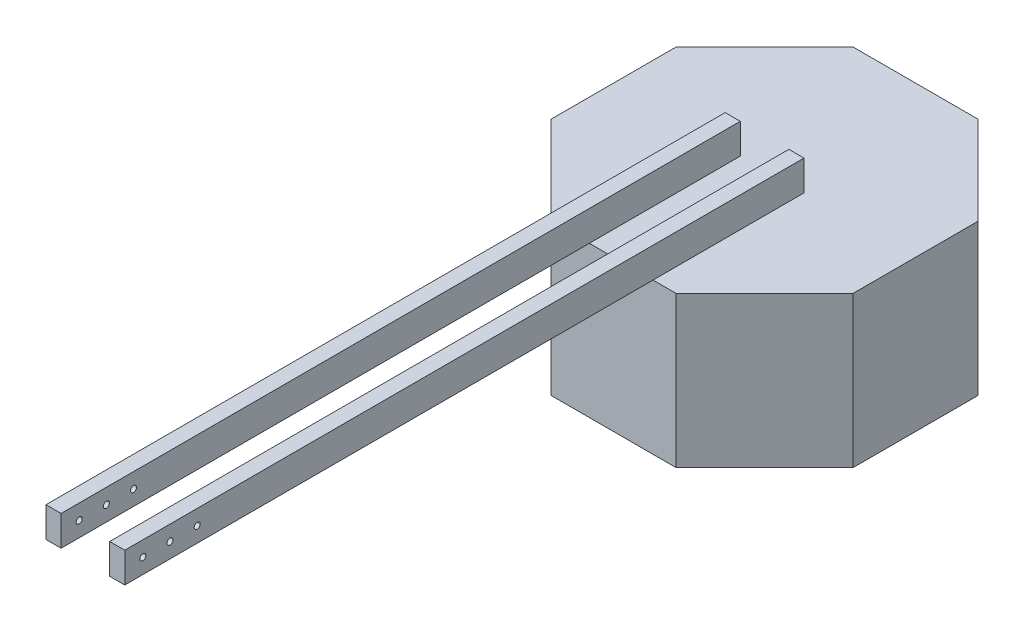
ISO-10303-21;
HEADER;
FILE_DESCRIPTION(('STEP AP214'),'2;1');
FILE_NAME('part.step','',(''),(''),'','','');
FILE_SCHEMA(('AUTOMOTIVE_DESIGN { 1 0 10303 214 1 1 1 1 }'));
ENDSEC;
DATA;
#1=APPLICATION_CONTEXT('core data for automotive mechanical design processes');
#2=APPLICATION_PROTOCOL_DEFINITION('international standard','automotive_design',2000,#1);
#3=PRODUCT_CONTEXT('',#1,'mechanical');
#4=PRODUCT('Part','Part','',(#3));
#5=PRODUCT_RELATED_PRODUCT_CATEGORY('part','',(#4));
#6=PRODUCT_DEFINITION_FORMATION('','',#4);
#7=PRODUCT_DEFINITION_CONTEXT('part definition',#1,'design');
#8=PRODUCT_DEFINITION('design','',#6,#7);
#9=PRODUCT_DEFINITION_SHAPE('','',#8);
#10=(LENGTH_UNIT() NAMED_UNIT(*) SI_UNIT(.MILLI.,.METRE.));
#11=(NAMED_UNIT(*) PLANE_ANGLE_UNIT() SI_UNIT($,.RADIAN.));
#12=(NAMED_UNIT(*) SI_UNIT($,.STERADIAN.) SOLID_ANGLE_UNIT());
#13=UNCERTAINTY_MEASURE_WITH_UNIT(LENGTH_MEASURE(1.E-05),#10,'distance_accuracy_value','');
#14=(GEOMETRIC_REPRESENTATION_CONTEXT(3) GLOBAL_UNCERTAINTY_ASSIGNED_CONTEXT((#13)) GLOBAL_UNIT_ASSIGNED_CONTEXT((#10,
#11,#12)) REPRESENTATION_CONTEXT('',''));
#15=CARTESIAN_POINT('',(0.,0.,0.));
#16=DIRECTION('',(0.,0.,1.));
#17=DIRECTION('',(1.,0.,0.));
#18=AXIS2_PLACEMENT_3D('',#15,#16,#17);
#19=CARTESIAN_POINT('',(100.,100.,-41.4213562373095));
#20=DIRECTION('',(-0.707106781186547,0.,0.707106781186548));
#21=DIRECTION('',(0.707106781186548,0.,0.707106781186547));
#22=AXIS2_PLACEMENT_3D('',#19,#20,#21);
#23=PLANE('',#22);
#24=DIRECTION('',(-0.707106781186548,0.,-0.707106781186547));
#25=VECTOR('',#24,1.);
#26=CARTESIAN_POINT('',(100.,0.,-41.4213562373095));
#27=LINE('',#26,#25);
#28=CARTESIAN_POINT('',(100.,0.,-41.4213562373095));
#29=VERTEX_POINT('',#28);
#30=CARTESIAN_POINT('',(41.4213562373095,0.,-100.));
#31=VERTEX_POINT('',#30);
#32=EDGE_CURVE('E187',#29,#31,#27,.T.);
#33=ORIENTED_EDGE('',*,*,#32,.T.);
#34=DIRECTION('',(0.,-1.,0.));
#35=VECTOR('',#34,1.);
#36=CARTESIAN_POINT('',(41.4213562373095,100.,-100.));
#37=LINE('',#36,#35);
#38=CARTESIAN_POINT('',(41.4213562373095,100.,-100.));
#39=VERTEX_POINT('',#38);
#40=EDGE_CURVE('E42',#39,#31,#37,.T.);
#41=ORIENTED_EDGE('',*,*,#40,.F.);
#42=DIRECTION('',(-0.707106781186548,0.,-0.707106781186547));
#43=VECTOR('',#42,1.);
#44=CARTESIAN_POINT('',(100.,100.,-41.4213562373095));
#45=LINE('',#44,#43);
#46=CARTESIAN_POINT('',(100.,100.,-41.4213562373095));
#47=VERTEX_POINT('',#46);
#48=EDGE_CURVE('E228',#47,#39,#45,.T.);
#49=ORIENTED_EDGE('',*,*,#48,.F.);
#50=DIRECTION('',(0.,-1.,0.));
#51=VECTOR('',#50,1.);
#52=CARTESIAN_POINT('',(100.,100.,-41.4213562373095));
#53=LINE('',#52,#51);
#54=EDGE_CURVE('E248',#47,#29,#53,.T.);
#55=ORIENTED_EDGE('',*,*,#54,.T.);
#56=EDGE_LOOP('',(#33,#41,#49,#55));
#57=FACE_BOUND('',#56,.T.);
#58=ADVANCED_FACE('F39',(#57),#23,.F.);
#59=CARTESIAN_POINT('',(41.4213562373095,100.,-100.));
#60=DIRECTION('',(0.,0.,1.));
#61=DIRECTION('',(1.,0.,0.));
#62=AXIS2_PLACEMENT_3D('',#59,#60,#61);
#63=PLANE('',#62);
#64=DIRECTION('',(-1.,0.,0.));
#65=VECTOR('',#64,1.);
#66=CARTESIAN_POINT('',(41.4213562373095,0.,-100.));
#67=LINE('',#66,#65);
#68=CARTESIAN_POINT('',(-41.4213562373095,0.,-100.));
#69=VERTEX_POINT('',#68);
#70=EDGE_CURVE('E190',#31,#69,#67,.T.);
#71=ORIENTED_EDGE('',*,*,#70,.T.);
#72=DIRECTION('',(0.,-1.,0.));
#73=VECTOR('',#72,1.);
#74=CARTESIAN_POINT('',(-41.4213562373095,100.,-100.));
#75=LINE('',#74,#73);
#76=CARTESIAN_POINT('',(-41.4213562373095,100.,-100.));
#77=VERTEX_POINT('',#76);
#78=EDGE_CURVE('E278',#77,#69,#75,.T.);
#79=ORIENTED_EDGE('',*,*,#78,.F.);
#80=DIRECTION('',(-1.,0.,0.));
#81=VECTOR('',#80,1.);
#82=CARTESIAN_POINT('',(41.4213562373095,100.,-100.));
#83=LINE('',#82,#81);
#84=EDGE_CURVE('E231',#39,#77,#83,.T.);
#85=ORIENTED_EDGE('',*,*,#84,.F.);
#86=ORIENTED_EDGE('',*,*,#40,.T.);
#87=EDGE_LOOP('',(#71,#79,#85,#86));
#88=FACE_BOUND('',#87,.T.);
#89=ADVANCED_FACE('F332',(#88),#63,.F.);
#90=CARTESIAN_POINT('',(-41.4213562373095,100.,-100.));
#91=DIRECTION('',(0.707106781186548,0.,0.707106781186548));
#92=DIRECTION('',(0.707106781186548,0.,-0.707106781186548));
#93=AXIS2_PLACEMENT_3D('',#90,#91,#92);
#94=PLANE('',#93);
#95=DIRECTION('',(-0.707106781186548,0.,0.707106781186548));
#96=VECTOR('',#95,1.);
#97=CARTESIAN_POINT('',(-41.4213562373095,0.,-100.));
#98=LINE('',#97,#96);
#99=CARTESIAN_POINT('',(-100.,0.,-41.4213562373095));
#100=VERTEX_POINT('',#99);
#101=EDGE_CURVE('E251',#69,#100,#98,.T.);
#102=ORIENTED_EDGE('',*,*,#101,.T.);
#103=DIRECTION('',(0.,-1.,0.));
#104=VECTOR('',#103,1.);
#105=CARTESIAN_POINT('',(-100.,100.,-41.4213562373095));
#106=LINE('',#105,#104);
#107=CARTESIAN_POINT('',(-100.,100.,-41.4213562373095));
#108=VERTEX_POINT('',#107);
#109=EDGE_CURVE('E276',#108,#100,#106,.T.);
#110=ORIENTED_EDGE('',*,*,#109,.F.);
#111=DIRECTION('',(-0.707106781186548,0.,0.707106781186548));
#112=VECTOR('',#111,1.);
#113=CARTESIAN_POINT('',(-41.4213562373095,100.,-100.));
#114=LINE('',#113,#112);
#115=EDGE_CURVE('E234',#77,#108,#114,.T.);
#116=ORIENTED_EDGE('',*,*,#115,.F.);
#117=ORIENTED_EDGE('',*,*,#78,.T.);
#118=EDGE_LOOP('',(#102,#110,#116,#117));
#119=FACE_BOUND('',#118,.T.);
#120=ADVANCED_FACE('F334',(#119),#94,.F.);
#121=CARTESIAN_POINT('',(-100.,100.,-41.4213562373095));
#122=DIRECTION('',(1.,0.,0.));
#123=DIRECTION('',(0.,0.,-1.));
#124=AXIS2_PLACEMENT_3D('',#121,#122,#123);
#125=PLANE('',#124);
#126=DIRECTION('',(0.,0.,1.));
#127=VECTOR('',#126,1.);
#128=CARTESIAN_POINT('',(-100.,0.,-41.4213562373095));
#129=LINE('',#128,#127);
#130=CARTESIAN_POINT('',(-100.,0.,41.4213562373096));
#131=VERTEX_POINT('',#130);
#132=EDGE_CURVE('E253',#100,#131,#129,.T.);
#133=ORIENTED_EDGE('',*,*,#132,.T.);
#134=DIRECTION('',(0.,-1.,0.));
#135=VECTOR('',#134,1.);
#136=CARTESIAN_POINT('',(-100.,100.,41.4213562373096));
#137=LINE('',#136,#135);
#138=CARTESIAN_POINT('',(-100.,100.,41.4213562373096));
#139=VERTEX_POINT('',#138);
#140=EDGE_CURVE('E273',#139,#131,#137,.T.);
#141=ORIENTED_EDGE('',*,*,#140,.F.);
#142=DIRECTION('',(0.,0.,1.));
#143=VECTOR('',#142,1.);
#144=CARTESIAN_POINT('',(-100.,100.,-41.4213562373095));
#145=LINE('',#144,#143);
#146=EDGE_CURVE('E236',#108,#139,#145,.T.);
#147=ORIENTED_EDGE('',*,*,#146,.F.);
#148=ORIENTED_EDGE('',*,*,#109,.T.);
#149=EDGE_LOOP('',(#133,#141,#147,#148));
#150=FACE_BOUND('',#149,.T.);
#151=ADVANCED_FACE('F340',(#150),#125,.F.);
#152=CARTESIAN_POINT('',(-100.,100.,41.4213562373096));
#153=DIRECTION('',(0.707106781186548,0.,-0.707106781186548));
#154=DIRECTION('',(-0.707106781186548,0.,-0.707106781186548));
#155=AXIS2_PLACEMENT_3D('',#152,#153,#154);
#156=PLANE('',#155);
#157=DIRECTION('',(0.707106781186548,0.,0.707106781186548));
#158=VECTOR('',#157,1.);
#159=CARTESIAN_POINT('',(-100.,0.,41.4213562373096));
#160=LINE('',#159,#158);
#161=CARTESIAN_POINT('',(-41.4213562373095,0.,100.));
#162=VERTEX_POINT('',#161);
#163=EDGE_CURVE('E255',#131,#162,#160,.T.);
#164=ORIENTED_EDGE('',*,*,#163,.T.);
#165=DIRECTION('',(0.,-1.,0.));
#166=VECTOR('',#165,1.);
#167=CARTESIAN_POINT('',(-41.4213562373095,100.,100.));
#168=LINE('',#167,#166);
#169=CARTESIAN_POINT('',(-41.4213562373095,100.,100.));
#170=VERTEX_POINT('',#169);
#171=EDGE_CURVE('E270',#170,#162,#168,.T.);
#172=ORIENTED_EDGE('',*,*,#171,.F.);
#173=DIRECTION('',(0.707106781186548,0.,0.707106781186548));
#174=VECTOR('',#173,1.);
#175=CARTESIAN_POINT('',(-100.,100.,41.4213562373096));
#176=LINE('',#175,#174);
#177=EDGE_CURVE('E238',#139,#170,#176,.T.);
#178=ORIENTED_EDGE('',*,*,#177,.F.);
#179=ORIENTED_EDGE('',*,*,#140,.T.);
#180=EDGE_LOOP('',(#164,#172,#178,#179));
#181=FACE_BOUND('',#180,.T.);
#182=ADVANCED_FACE('F343',(#181),#156,.F.);
#183=CARTESIAN_POINT('',(-41.4213562373095,100.,100.));
#184=DIRECTION('',(0.,0.,-1.));
#185=DIRECTION('',(-1.,0.,0.));
#186=AXIS2_PLACEMENT_3D('',#183,#184,#185);
#187=PLANE('',#186);
#188=DIRECTION('',(1.,0.,0.));
#189=VECTOR('',#188,1.);
#190=CARTESIAN_POINT('',(-41.4213562373095,0.,100.));
#191=LINE('',#190,#189);
#192=CARTESIAN_POINT('',(41.4213562373095,0.,100.));
#193=VERTEX_POINT('',#192);
#194=EDGE_CURVE('E257',#162,#193,#191,.T.);
#195=ORIENTED_EDGE('',*,*,#194,.T.);
#196=DIRECTION('',(0.,-1.,0.));
#197=VECTOR('',#196,1.);
#198=CARTESIAN_POINT('',(41.4213562373095,100.,100.));
#199=LINE('',#198,#197);
#200=CARTESIAN_POINT('',(41.4213562373095,100.,100.));
#201=VERTEX_POINT('',#200);
#202=EDGE_CURVE('E267',#201,#193,#199,.T.);
#203=ORIENTED_EDGE('',*,*,#202,.F.);
#204=DIRECTION('',(1.,0.,0.));
#205=VECTOR('',#204,1.);
#206=CARTESIAN_POINT('',(-41.4213562373095,100.,100.));
#207=LINE('',#206,#205);
#208=CARTESIAN_POINT('',(26.1,100.,100.));
#209=VERTEX_POINT('',#208);
#210=EDGE_CURVE('E240',#209,#201,#207,.T.);
#211=ORIENTED_EDGE('',*,*,#210,.F.);
#212=CARTESIAN_POINT('',(16.1,100.,100.));
#213=VERTEX_POINT('',#212);
#214=EDGE_CURVE('E307',#213,#209,#207,.T.);
#215=ORIENTED_EDGE('',*,*,#214,.F.);
#216=CARTESIAN_POINT('',(-16.1,100.,100.));
#217=VERTEX_POINT('',#216);
#218=EDGE_CURVE('E311',#217,#213,#207,.T.);
#219=ORIENTED_EDGE('',*,*,#218,.F.);
#220=CARTESIAN_POINT('',(-26.1,100.,100.));
#221=VERTEX_POINT('',#220);
#222=EDGE_CURVE('E245',#221,#217,#207,.T.);
#223=ORIENTED_EDGE('',*,*,#222,.F.);
#224=EDGE_CURVE('E241',#170,#221,#207,.T.);
#225=ORIENTED_EDGE('',*,*,#224,.F.);
#226=ORIENTED_EDGE('',*,*,#171,.T.);
#227=EDGE_LOOP('',(#195,#203,#211,#215,#219,#223,#225,#226));
#228=FACE_BOUND('',#227,.T.);
#229=ADVANCED_FACE('F316',(#228),#187,.F.);
#230=CARTESIAN_POINT('',(41.4213562373095,100.,100.));
#231=DIRECTION('',(-0.707106781186547,0.,-0.707106781186548));
#232=DIRECTION('',(-0.707106781186548,0.,0.707106781186547));
#233=AXIS2_PLACEMENT_3D('',#230,#231,#232);
#234=PLANE('',#233);
#235=DIRECTION('',(0.707106781186548,0.,-0.707106781186547));
#236=VECTOR('',#235,1.);
#237=CARTESIAN_POINT('',(41.4213562373095,0.,100.));
#238=LINE('',#237,#236);
#239=CARTESIAN_POINT('',(100.,0.,41.4213562373095));
#240=VERTEX_POINT('',#239);
#241=EDGE_CURVE('E259',#193,#240,#238,.T.);
#242=ORIENTED_EDGE('',*,*,#241,.T.);
#243=DIRECTION('',(0.,-1.,0.));
#244=VECTOR('',#243,1.);
#245=CARTESIAN_POINT('',(100.,100.,41.4213562373095));
#246=LINE('',#245,#244);
#247=CARTESIAN_POINT('',(100.,100.,41.4213562373095));
#248=VERTEX_POINT('',#247);
#249=EDGE_CURVE('E264',#248,#240,#246,.T.);
#250=ORIENTED_EDGE('',*,*,#249,.F.);
#251=DIRECTION('',(0.707106781186548,0.,-0.707106781186547));
#252=VECTOR('',#251,1.);
#253=CARTESIAN_POINT('',(41.4213562373095,100.,100.));
#254=LINE('',#253,#252);
#255=EDGE_CURVE('E244',#201,#248,#254,.T.);
#256=ORIENTED_EDGE('',*,*,#255,.F.);
#257=ORIENTED_EDGE('',*,*,#202,.T.);
#258=EDGE_LOOP('',(#242,#250,#256,#257));
#259=FACE_BOUND('',#258,.T.);
#260=ADVANCED_FACE('F320',(#259),#234,.F.);
#261=CARTESIAN_POINT('',(100.,100.,41.4213562373095));
#262=DIRECTION('',(-1.,0.,0.));
#263=DIRECTION('',(0.,0.,1.));
#264=AXIS2_PLACEMENT_3D('',#261,#262,#263);
#265=PLANE('',#264);
#266=DIRECTION('',(0.,0.,-1.));
#267=VECTOR('',#266,1.);
#268=CARTESIAN_POINT('',(100.,0.,41.4213562373095));
#269=LINE('',#268,#267);
#270=EDGE_CURVE('E232',#240,#29,#269,.T.);
#271=ORIENTED_EDGE('',*,*,#270,.T.);
#272=ORIENTED_EDGE('',*,*,#54,.F.);
#273=DIRECTION('',(0.,0.,-1.));
#274=VECTOR('',#273,1.);
#275=CARTESIAN_POINT('',(100.,100.,41.4213562373095));
#276=LINE('',#275,#274);
#277=EDGE_CURVE('E247',#248,#47,#276,.T.);
#278=ORIENTED_EDGE('',*,*,#277,.F.);
#279=ORIENTED_EDGE('',*,*,#249,.T.);
#280=EDGE_LOOP('',(#271,#272,#278,#279));
#281=FACE_BOUND('',#280,.T.);
#282=ADVANCED_FACE('F325',(#281),#265,.F.);
#283=CARTESIAN_POINT('',(0.,100.,0.));
#284=DIRECTION('',(0.,1.,0.));
#285=DIRECTION('',(0.,0.,1.));
#286=AXIS2_PLACEMENT_3D('',#283,#284,#285);
#287=PLANE('',#286);
#288=DIRECTION('',(0.,0.,-1.));
#289=VECTOR('',#288,1.);
#290=CARTESIAN_POINT('',(-16.1,100.,0.));
#291=LINE('',#290,#289);
#292=CARTESIAN_POINT('',(-16.1,100.,0.));
#293=VERTEX_POINT('',#292);
#294=EDGE_CURVE('E11',#217,#293,#291,.T.);
#295=ORIENTED_EDGE('',*,*,#294,.F.);
#296=ORIENTED_EDGE('',*,*,#218,.T.);
#297=DIRECTION('',(0.,0.,1.));
#298=VECTOR('',#297,1.);
#299=CARTESIAN_POINT('',(16.1,100.,0.));
#300=LINE('',#299,#298);
#301=CARTESIAN_POINT('',(16.1,100.,0.));
#302=VERTEX_POINT('',#301);
#303=EDGE_CURVE('E214',#302,#213,#300,.T.);
#304=ORIENTED_EDGE('',*,*,#303,.F.);
#305=DIRECTION('',(-1.,0.,0.));
#306=VECTOR('',#305,1.);
#307=CARTESIAN_POINT('',(26.1,100.,0.));
#308=LINE('',#307,#306);
#309=CARTESIAN_POINT('',(26.1,100.,0.));
#310=VERTEX_POINT('',#309);
#311=EDGE_CURVE('E62',#310,#302,#308,.T.);
#312=ORIENTED_EDGE('',*,*,#311,.F.);
#313=DIRECTION('',(0.,0.,-1.));
#314=VECTOR('',#313,1.);
#315=CARTESIAN_POINT('',(26.1,100.,0.));
#316=LINE('',#315,#314);
#317=EDGE_CURVE('E47',#209,#310,#316,.T.);
#318=ORIENTED_EDGE('',*,*,#317,.F.);
#319=ORIENTED_EDGE('',*,*,#210,.T.);
#320=ORIENTED_EDGE('',*,*,#255,.T.);
#321=ORIENTED_EDGE('',*,*,#277,.T.);
#322=ORIENTED_EDGE('',*,*,#48,.T.);
#323=ORIENTED_EDGE('',*,*,#84,.T.);
#324=ORIENTED_EDGE('',*,*,#115,.T.);
#325=ORIENTED_EDGE('',*,*,#146,.T.);
#326=ORIENTED_EDGE('',*,*,#177,.T.);
#327=ORIENTED_EDGE('',*,*,#224,.T.);
#328=DIRECTION('',(0.,0.,1.));
#329=VECTOR('',#328,1.);
#330=CARTESIAN_POINT('',(-26.1,100.,0.));
#331=LINE('',#330,#329);
#332=CARTESIAN_POINT('',(-26.1,100.,0.));
#333=VERTEX_POINT('',#332);
#334=EDGE_CURVE('E348',#333,#221,#331,.T.);
#335=ORIENTED_EDGE('',*,*,#334,.F.);
#336=DIRECTION('',(-1.,0.,0.));
#337=VECTOR('',#336,1.);
#338=CARTESIAN_POINT('',(-26.1,100.,0.));
#339=LINE('',#338,#337);
#340=EDGE_CURVE('E56',#293,#333,#339,.T.);
#341=ORIENTED_EDGE('',*,*,#340,.F.);
#342=EDGE_LOOP('',(#295,#296,#304,#312,#318,#319,#320,#321,#322,#323,#324,#325,#326,#327,#335,#341));
#343=FACE_BOUND('',#342,.T.);
#344=ADVANCED_FACE('F313',(#343),#287,.T.);
#345=CARTESIAN_POINT('',(0.,0.,0.));
#346=DIRECTION('',(0.,1.,0.));
#347=DIRECTION('',(0.,0.,1.));
#348=AXIS2_PLACEMENT_3D('',#345,#346,#347);
#349=PLANE('',#348);
#350=ORIENTED_EDGE('',*,*,#32,.F.);
#351=ORIENTED_EDGE('',*,*,#270,.F.);
#352=ORIENTED_EDGE('',*,*,#241,.F.);
#353=ORIENTED_EDGE('',*,*,#194,.F.);
#354=ORIENTED_EDGE('',*,*,#163,.F.);
#355=ORIENTED_EDGE('',*,*,#132,.F.);
#356=ORIENTED_EDGE('',*,*,#101,.F.);
#357=ORIENTED_EDGE('',*,*,#70,.F.);
#358=EDGE_LOOP('',(#350,#351,#352,#353,#354,#355,#356,#357));
#359=FACE_BOUND('',#358,.T.);
#360=ADVANCED_FACE('F330',(#359),#349,.F.);
#361=CARTESIAN_POINT('',(26.1,120.,0.));
#362=DIRECTION('',(-1.,0.,0.));
#363=DIRECTION('',(0.,0.,1.));
#364=AXIS2_PLACEMENT_3D('',#361,#362,#363);
#365=PLANE('',#364);
#366=CARTESIAN_POINT('',(26.0999999999999,110.,438.));
#367=DIRECTION('',(-1.,0.,0.));
#368=DIRECTION('',(0.,0.,1.));
#369=AXIS2_PLACEMENT_3D('',#366,#367,#368);
#370=CIRCLE('',#369,2.);
#371=CARTESIAN_POINT('',(26.0999999999999,110.,440.));
#372=VERTEX_POINT('',#371);
#373=EDGE_CURVE('E200',#372,#372,#370,.T.);
#374=ORIENTED_EDGE('',*,*,#373,.T.);
#375=EDGE_LOOP('',(#374));
#376=FACE_BOUND('',#375,.T.);
#377=CARTESIAN_POINT('',(26.0999999999999,110.,420.));
#378=DIRECTION('',(-1.,0.,0.));
#379=DIRECTION('',(0.,0.,1.));
#380=AXIS2_PLACEMENT_3D('',#377,#378,#379);
#381=CIRCLE('',#380,2.);
#382=CARTESIAN_POINT('',(26.0999999999999,110.,422.));
#383=VERTEX_POINT('',#382);
#384=EDGE_CURVE('E376',#383,#383,#381,.T.);
#385=ORIENTED_EDGE('',*,*,#384,.T.);
#386=EDGE_LOOP('',(#385));
#387=FACE_BOUND('',#386,.T.);
#388=CARTESIAN_POINT('',(26.0999999999999,110.,402.));
#389=DIRECTION('',(-1.,0.,0.));
#390=DIRECTION('',(0.,0.,1.));
#391=AXIS2_PLACEMENT_3D('',#388,#389,#390);
#392=CIRCLE('',#391,2.);
#393=CARTESIAN_POINT('',(26.0999999999999,110.,404.));
#394=VERTEX_POINT('',#393);
#395=EDGE_CURVE('E385',#394,#394,#392,.T.);
#396=ORIENTED_EDGE('',*,*,#395,.T.);
#397=EDGE_LOOP('',(#396));
#398=FACE_BOUND('',#397,.T.);
#399=CARTESIAN_POINT('',(26.0999999999999,100.,450.));
#400=VERTEX_POINT('',#399);
#401=EDGE_CURVE('E218',#400,#209,#316,.T.);
#402=ORIENTED_EDGE('',*,*,#401,.T.);
#403=ORIENTED_EDGE('',*,*,#317,.T.);
#404=DIRECTION('',(0.,-1.,0.));
#405=VECTOR('',#404,1.);
#406=CARTESIAN_POINT('',(26.1,120.,0.));
#407=LINE('',#406,#405);
#408=CARTESIAN_POINT('',(26.1,120.,0.));
#409=VERTEX_POINT('',#408);
#410=EDGE_CURVE('E196',#409,#310,#407,.T.);
#411=ORIENTED_EDGE('',*,*,#410,.F.);
#412=DIRECTION('',(0.,0.,-1.));
#413=VECTOR('',#412,1.);
#414=CARTESIAN_POINT('',(26.1,120.,0.));
#415=LINE('',#414,#413);
#416=CARTESIAN_POINT('',(26.0999999999999,120.,450.));
#417=VERTEX_POINT('',#416);
#418=EDGE_CURVE('E213',#417,#409,#415,.T.);
#419=ORIENTED_EDGE('',*,*,#418,.F.);
#420=DIRECTION('',(0.,-1.,0.));
#421=VECTOR('',#420,1.);
#422=CARTESIAN_POINT('',(26.0999999999999,120.,450.));
#423=LINE('',#422,#421);
#424=EDGE_CURVE('E206',#417,#400,#423,.T.);
#425=ORIENTED_EDGE('',*,*,#424,.T.);
#426=EDGE_LOOP('',(#402,#403,#411,#419,#425));
#427=FACE_BOUND('',#426,.T.);
#428=ADVANCED_FACE('F289',(#376,#387,#398,#427),#365,.F.);
#429=CARTESIAN_POINT('',(26.1,120.,0.));
#430=DIRECTION('',(0.,0.,1.));
#431=DIRECTION('',(1.,0.,0.));
#432=AXIS2_PLACEMENT_3D('',#429,#430,#431);
#433=PLANE('',#432);
#434=ORIENTED_EDGE('',*,*,#311,.T.);
#435=DIRECTION('',(0.,-1.,0.));
#436=VECTOR('',#435,1.);
#437=CARTESIAN_POINT('',(16.1,120.,0.));
#438=LINE('',#437,#436);
#439=CARTESIAN_POINT('',(16.1,120.,0.));
#440=VERTEX_POINT('',#439);
#441=EDGE_CURVE('E199',#440,#302,#438,.T.);
#442=ORIENTED_EDGE('',*,*,#441,.F.);
#443=DIRECTION('',(-1.,0.,0.));
#444=VECTOR('',#443,1.);
#445=CARTESIAN_POINT('',(26.1,120.,0.));
#446=LINE('',#445,#444);
#447=EDGE_CURVE('E224',#409,#440,#446,.T.);
#448=ORIENTED_EDGE('',*,*,#447,.F.);
#449=ORIENTED_EDGE('',*,*,#410,.T.);
#450=EDGE_LOOP('',(#434,#442,#448,#449));
#451=FACE_BOUND('',#450,.T.);
#452=ADVANCED_FACE('F294',(#451),#433,.F.);
#453=CARTESIAN_POINT('',(16.1,120.,0.));
#454=DIRECTION('',(1.,0.,0.));
#455=DIRECTION('',(0.,0.,-1.));
#456=AXIS2_PLACEMENT_3D('',#453,#454,#455);
#457=PLANE('',#456);
#458=CARTESIAN_POINT('',(16.0999999999999,110.,438.));
#459=DIRECTION('',(1.,0.,0.));
#460=DIRECTION('',(0.,0.,-1.));
#461=AXIS2_PLACEMENT_3D('',#458,#459,#460);
#462=CIRCLE('',#461,2.);
#463=CARTESIAN_POINT('',(16.0999999999999,110.,436.));
#464=VERTEX_POINT('',#463);
#465=EDGE_CURVE('E370',#464,#464,#462,.T.);
#466=ORIENTED_EDGE('',*,*,#465,.T.);
#467=EDGE_LOOP('',(#466));
#468=FACE_BOUND('',#467,.T.);
#469=CARTESIAN_POINT('',(16.0999999999999,110.,420.));
#470=DIRECTION('',(1.,0.,0.));
#471=DIRECTION('',(0.,0.,-1.));
#472=AXIS2_PLACEMENT_3D('',#469,#470,#471);
#473=CIRCLE('',#472,2.);
#474=CARTESIAN_POINT('',(16.0999999999999,110.,418.));
#475=VERTEX_POINT('',#474);
#476=EDGE_CURVE('E379',#475,#475,#473,.T.);
#477=ORIENTED_EDGE('',*,*,#476,.T.);
#478=EDGE_LOOP('',(#477));
#479=FACE_BOUND('',#478,.T.);
#480=CARTESIAN_POINT('',(16.0999999999999,110.,402.));
#481=DIRECTION('',(1.,0.,0.));
#482=DIRECTION('',(0.,0.,-1.));
#483=AXIS2_PLACEMENT_3D('',#480,#481,#482);
#484=CIRCLE('',#483,2.);
#485=CARTESIAN_POINT('',(16.0999999999999,110.,400.));
#486=VERTEX_POINT('',#485);
#487=EDGE_CURVE('E388',#486,#486,#484,.T.);
#488=ORIENTED_EDGE('',*,*,#487,.T.);
#489=EDGE_LOOP('',(#488));
#490=FACE_BOUND('',#489,.T.);
#491=ORIENTED_EDGE('',*,*,#303,.T.);
#492=CARTESIAN_POINT('',(16.0999999999999,100.,450.));
#493=VERTEX_POINT('',#492);
#494=EDGE_CURVE('E212',#213,#493,#300,.T.);
#495=ORIENTED_EDGE('',*,*,#494,.T.);
#496=DIRECTION('',(0.,-1.,0.));
#497=VECTOR('',#496,1.);
#498=CARTESIAN_POINT('',(16.0999999999999,120.,450.));
#499=LINE('',#498,#497);
#500=CARTESIAN_POINT('',(16.0999999999999,120.,450.));
#501=VERTEX_POINT('',#500);
#502=EDGE_CURVE('E203',#501,#493,#499,.T.);
#503=ORIENTED_EDGE('',*,*,#502,.F.);
#504=DIRECTION('',(0.,0.,1.));
#505=VECTOR('',#504,1.);
#506=CARTESIAN_POINT('',(16.1,120.,0.));
#507=LINE('',#506,#505);
#508=EDGE_CURVE('E222',#440,#501,#507,.T.);
#509=ORIENTED_EDGE('',*,*,#508,.F.);
#510=ORIENTED_EDGE('',*,*,#441,.T.);
#511=EDGE_LOOP('',(#491,#495,#503,#509,#510));
#512=FACE_BOUND('',#511,.T.);
#513=ADVANCED_FACE('F464',(#468,#479,#490,#512),#457,.F.);
#514=CARTESIAN_POINT('',(26.0999999999999,120.,450.));
#515=DIRECTION('',(0.,0.,-1.));
#516=DIRECTION('',(-1.,0.,0.));
#517=AXIS2_PLACEMENT_3D('',#514,#515,#516);
#518=PLANE('',#517);
#519=DIRECTION('',(1.,0.,0.));
#520=VECTOR('',#519,1.);
#521=CARTESIAN_POINT('',(26.0999999999999,100.,450.));
#522=LINE('',#521,#520);
#523=EDGE_CURVE('E210',#493,#400,#522,.T.);
#524=ORIENTED_EDGE('',*,*,#523,.T.);
#525=ORIENTED_EDGE('',*,*,#424,.F.);
#526=DIRECTION('',(1.,0.,0.));
#527=VECTOR('',#526,1.);
#528=CARTESIAN_POINT('',(26.0999999999999,120.,450.));
#529=LINE('',#528,#527);
#530=EDGE_CURVE('E209',#501,#417,#529,.T.);
#531=ORIENTED_EDGE('',*,*,#530,.F.);
#532=ORIENTED_EDGE('',*,*,#502,.T.);
#533=EDGE_LOOP('',(#524,#525,#531,#532));
#534=FACE_BOUND('',#533,.T.);
#535=ADVANCED_FACE('F459',(#534),#518,.F.);
#536=CARTESIAN_POINT('',(0.,120.,0.));
#537=DIRECTION('',(0.,-1.,0.));
#538=DIRECTION('',(0.,0.,-1.));
#539=AXIS2_PLACEMENT_3D('',#536,#537,#538);
#540=PLANE('',#539);
#541=ORIENTED_EDGE('',*,*,#418,.T.);
#542=ORIENTED_EDGE('',*,*,#447,.T.);
#543=ORIENTED_EDGE('',*,*,#508,.T.);
#544=ORIENTED_EDGE('',*,*,#530,.T.);
#545=EDGE_LOOP('',(#541,#542,#543,#544));
#546=FACE_BOUND('',#545,.T.);
#547=ADVANCED_FACE('F298',(#546),#540,.F.);
#548=CARTESIAN_POINT('',(0.,100.,0.));
#549=DIRECTION('',(0.,-1.,0.));
#550=DIRECTION('',(0.,0.,-1.));
#551=AXIS2_PLACEMENT_3D('',#548,#549,#550);
#552=PLANE('',#551);
#553=ORIENTED_EDGE('',*,*,#494,.F.);
#554=ORIENTED_EDGE('',*,*,#214,.T.);
#555=ORIENTED_EDGE('',*,*,#401,.F.);
#556=ORIENTED_EDGE('',*,*,#523,.F.);
#557=EDGE_LOOP('',(#553,#554,#555,#556));
#558=FACE_BOUND('',#557,.T.);
#559=ADVANCED_FACE('F306',(#558),#552,.T.);
#560=CARTESIAN_POINT('',(0.,100.,0.));
#561=DIRECTION('',(0.,1.,0.));
#562=DIRECTION('',(0.,0.,1.));
#563=AXIS2_PLACEMENT_3D('',#560,#561,#562);
#564=PLANE('',#563);
#565=CARTESIAN_POINT('',(-26.0999999999999,100.,450.));
#566=VERTEX_POINT('',#565);
#567=EDGE_CURVE('E351',#221,#566,#331,.T.);
#568=ORIENTED_EDGE('',*,*,#567,.F.);
#569=ORIENTED_EDGE('',*,*,#222,.T.);
#570=CARTESIAN_POINT('',(-16.0999999999999,100.,450.));
#571=VERTEX_POINT('',#570);
#572=EDGE_CURVE('E49',#571,#217,#291,.T.);
#573=ORIENTED_EDGE('',*,*,#572,.F.);
#574=DIRECTION('',(1.,0.,0.));
#575=VECTOR('',#574,1.);
#576=CARTESIAN_POINT('',(-26.0999999999999,100.,450.));
#577=LINE('',#576,#575);
#578=EDGE_CURVE('E183',#566,#571,#577,.T.);
#579=ORIENTED_EDGE('',*,*,#578,.F.);
#580=EDGE_LOOP('',(#568,#569,#573,#579));
#581=FACE_BOUND('',#580,.T.);
#582=ADVANCED_FACE('F352',(#581),#564,.F.);
#583=CARTESIAN_POINT('',(-16.1,120.,0.));
#584=DIRECTION('',(-1.,0.,0.));
#585=DIRECTION('',(0.,0.,1.));
#586=AXIS2_PLACEMENT_3D('',#583,#584,#585);
#587=PLANE('',#586);
#588=CARTESIAN_POINT('',(-16.0999999999999,110.,438.));
#589=DIRECTION('',(-1.,0.,0.));
#590=DIRECTION('',(0.,0.,1.));
#591=AXIS2_PLACEMENT_3D('',#588,#589,#590);
#592=CIRCLE('',#591,2.);
#593=CARTESIAN_POINT('',(-16.0999999999999,110.,440.));
#594=VERTEX_POINT('',#593);
#595=EDGE_CURVE('E373',#594,#594,#592,.T.);
#596=ORIENTED_EDGE('',*,*,#595,.T.);
#597=EDGE_LOOP('',(#596));
#598=FACE_BOUND('',#597,.T.);
#599=CARTESIAN_POINT('',(-16.0999999999999,110.,420.));
#600=DIRECTION('',(-1.,0.,0.));
#601=DIRECTION('',(0.,0.,1.));
#602=AXIS2_PLACEMENT_3D('',#599,#600,#601);
#603=CIRCLE('',#602,2.);
#604=CARTESIAN_POINT('',(-16.0999999999999,110.,422.));
#605=VERTEX_POINT('',#604);
#606=EDGE_CURVE('E382',#605,#605,#603,.T.);
#607=ORIENTED_EDGE('',*,*,#606,.T.);
#608=EDGE_LOOP('',(#607));
#609=FACE_BOUND('',#608,.T.);
#610=CARTESIAN_POINT('',(-16.0999999999999,110.,402.));
#611=DIRECTION('',(-1.,0.,0.));
#612=DIRECTION('',(0.,0.,1.));
#613=AXIS2_PLACEMENT_3D('',#610,#611,#612);
#614=CIRCLE('',#613,2.);
#615=CARTESIAN_POINT('',(-16.0999999999999,110.,404.));
#616=VERTEX_POINT('',#615);
#617=EDGE_CURVE('E391',#616,#616,#614,.T.);
#618=ORIENTED_EDGE('',*,*,#617,.T.);
#619=EDGE_LOOP('',(#618));
#620=FACE_BOUND('',#619,.T.);
#621=ORIENTED_EDGE('',*,*,#572,.T.);
#622=ORIENTED_EDGE('',*,*,#294,.T.);
#623=DIRECTION('',(0.,-1.,0.));
#624=VECTOR('',#623,1.);
#625=CARTESIAN_POINT('',(-16.1,120.,0.));
#626=LINE('',#625,#624);
#627=CARTESIAN_POINT('',(-16.1,120.,0.));
#628=VERTEX_POINT('',#627);
#629=EDGE_CURVE('E168',#628,#293,#626,.T.);
#630=ORIENTED_EDGE('',*,*,#629,.F.);
#631=DIRECTION('',(0.,0.,-1.));
#632=VECTOR('',#631,1.);
#633=CARTESIAN_POINT('',(-16.1,120.,0.));
#634=LINE('',#633,#632);
#635=CARTESIAN_POINT('',(-16.0999999999999,120.,450.));
#636=VERTEX_POINT('',#635);
#637=EDGE_CURVE('E174',#636,#628,#634,.T.);
#638=ORIENTED_EDGE('',*,*,#637,.F.);
#639=DIRECTION('',(0.,-1.,0.));
#640=VECTOR('',#639,1.);
#641=CARTESIAN_POINT('',(-16.0999999999999,120.,450.));
#642=LINE('',#641,#640);
#643=EDGE_CURVE('E362',#636,#571,#642,.T.);
#644=ORIENTED_EDGE('',*,*,#643,.T.);
#645=EDGE_LOOP('',(#621,#622,#630,#638,#644));
#646=FACE_BOUND('',#645,.T.);
#647=ADVANCED_FACE('F186',(#598,#609,#620,#646),#587,.F.);
#648=CARTESIAN_POINT('',(-26.1,120.,0.));
#649=DIRECTION('',(0.,0.,1.));
#650=DIRECTION('',(1.,0.,0.));
#651=AXIS2_PLACEMENT_3D('',#648,#649,#650);
#652=PLANE('',#651);
#653=ORIENTED_EDGE('',*,*,#340,.T.);
#654=DIRECTION('',(0.,-1.,0.));
#655=VECTOR('',#654,1.);
#656=CARTESIAN_POINT('',(-26.1,120.,0.));
#657=LINE('',#656,#655);
#658=CARTESIAN_POINT('',(-26.1,120.,0.));
#659=VERTEX_POINT('',#658);
#660=EDGE_CURVE('E170',#659,#333,#657,.T.);
#661=ORIENTED_EDGE('',*,*,#660,.F.);
#662=DIRECTION('',(-1.,0.,0.));
#663=VECTOR('',#662,1.);
#664=CARTESIAN_POINT('',(-26.1,120.,0.));
#665=LINE('',#664,#663);
#666=EDGE_CURVE('E164',#628,#659,#665,.T.);
#667=ORIENTED_EDGE('',*,*,#666,.F.);
#668=ORIENTED_EDGE('',*,*,#629,.T.);
#669=EDGE_LOOP('',(#653,#661,#667,#668));
#670=FACE_BOUND('',#669,.T.);
#671=ADVANCED_FACE('F166',(#670),#652,.F.);
#672=CARTESIAN_POINT('',(-26.1,120.,0.));
#673=DIRECTION('',(1.,0.,0.));
#674=DIRECTION('',(0.,0.,-1.));
#675=AXIS2_PLACEMENT_3D('',#672,#673,#674);
#676=PLANE('',#675);
#677=CARTESIAN_POINT('',(-26.1,110.,438.));
#678=DIRECTION('',(-1.,0.,0.));
#679=DIRECTION('',(0.,0.,1.));
#680=AXIS2_PLACEMENT_3D('',#677,#678,#679);
#681=CIRCLE('',#680,2.);
#682=CARTESIAN_POINT('',(-26.1,110.,440.));
#683=VERTEX_POINT('',#682);
#684=EDGE_CURVE('E394',#683,#683,#681,.T.);
#685=ORIENTED_EDGE('',*,*,#684,.F.);
#686=EDGE_LOOP('',(#685));
#687=FACE_BOUND('',#686,.T.);
#688=CARTESIAN_POINT('',(-26.1,110.,420.));
#689=DIRECTION('',(-1.,0.,0.));
#690=DIRECTION('',(0.,0.,1.));
#691=AXIS2_PLACEMENT_3D('',#688,#689,#690);
#692=CIRCLE('',#691,2.);
#693=CARTESIAN_POINT('',(-26.1,110.,422.));
#694=VERTEX_POINT('',#693);
#695=EDGE_CURVE('E398',#694,#694,#692,.T.);
#696=ORIENTED_EDGE('',*,*,#695,.F.);
#697=EDGE_LOOP('',(#696));
#698=FACE_BOUND('',#697,.T.);
#699=CARTESIAN_POINT('',(-26.1,110.,402.));
#700=DIRECTION('',(-1.,0.,0.));
#701=DIRECTION('',(0.,0.,1.));
#702=AXIS2_PLACEMENT_3D('',#699,#700,#701);
#703=CIRCLE('',#702,2.);
#704=CARTESIAN_POINT('',(-26.1,110.,404.));
#705=VERTEX_POINT('',#704);
#706=EDGE_CURVE('E395',#705,#705,#703,.T.);
#707=ORIENTED_EDGE('',*,*,#706,.F.);
#708=EDGE_LOOP('',(#707));
#709=FACE_BOUND('',#708,.T.);
#710=ORIENTED_EDGE('',*,*,#334,.T.);
#711=ORIENTED_EDGE('',*,*,#567,.T.);
#712=DIRECTION('',(0.,-1.,0.));
#713=VECTOR('',#712,1.);
#714=CARTESIAN_POINT('',(-26.0999999999999,120.,450.));
#715=LINE('',#714,#713);
#716=CARTESIAN_POINT('',(-26.0999999999999,120.,450.));
#717=VERTEX_POINT('',#716);
#718=EDGE_CURVE('E192',#717,#566,#715,.T.);
#719=ORIENTED_EDGE('',*,*,#718,.F.);
#720=DIRECTION('',(0.,0.,1.));
#721=VECTOR('',#720,1.);
#722=CARTESIAN_POINT('',(-26.1,120.,0.));
#723=LINE('',#722,#721);
#724=EDGE_CURVE('E173',#659,#717,#723,.T.);
#725=ORIENTED_EDGE('',*,*,#724,.F.);
#726=ORIENTED_EDGE('',*,*,#660,.T.);
#727=EDGE_LOOP('',(#710,#711,#719,#725,#726));
#728=FACE_BOUND('',#727,.T.);
#729=ADVANCED_FACE('F358',(#687,#698,#709,#728),#676,.F.);
#730=CARTESIAN_POINT('',(-26.0999999999999,120.,450.));
#731=DIRECTION('',(0.,0.,-1.));
#732=DIRECTION('',(-1.,0.,0.));
#733=AXIS2_PLACEMENT_3D('',#730,#731,#732);
#734=PLANE('',#733);
#735=ORIENTED_EDGE('',*,*,#578,.T.);
#736=ORIENTED_EDGE('',*,*,#643,.F.);
#737=DIRECTION('',(1.,0.,0.));
#738=VECTOR('',#737,1.);
#739=CARTESIAN_POINT('',(-26.0999999999999,120.,450.));
#740=LINE('',#739,#738);
#741=EDGE_CURVE('E179',#717,#636,#740,.T.);
#742=ORIENTED_EDGE('',*,*,#741,.F.);
#743=ORIENTED_EDGE('',*,*,#718,.T.);
#744=EDGE_LOOP('',(#735,#736,#742,#743));
#745=FACE_BOUND('',#744,.T.);
#746=ADVANCED_FACE('F364',(#745),#734,.F.);
#747=CARTESIAN_POINT('',(0.,120.,0.));
#748=DIRECTION('',(0.,1.,0.));
#749=DIRECTION('',(0.,0.,1.));
#750=AXIS2_PLACEMENT_3D('',#747,#748,#749);
#751=PLANE('',#750);
#752=ORIENTED_EDGE('',*,*,#637,.T.);
#753=ORIENTED_EDGE('',*,*,#666,.T.);
#754=ORIENTED_EDGE('',*,*,#724,.T.);
#755=ORIENTED_EDGE('',*,*,#741,.T.);
#756=EDGE_LOOP('',(#752,#753,#754,#755));
#757=FACE_BOUND('',#756,.T.);
#758=ADVANCED_FACE('F177',(#757),#751,.T.);
#759=CARTESIAN_POINT('',(100.,110.,402.));
#760=DIRECTION('',(-1.,0.,0.));
#761=DIRECTION('',(0.,0.,1.));
#762=AXIS2_PLACEMENT_3D('',#759,#760,#761);
#763=CYLINDRICAL_SURFACE('',#762,2.);
#764=ORIENTED_EDGE('',*,*,#706,.T.);
#765=EDGE_LOOP('',(#764));
#766=FACE_BOUND('',#765,.T.);
#767=ORIENTED_EDGE('',*,*,#617,.F.);
#768=EDGE_LOOP('',(#767));
#769=FACE_BOUND('',#768,.T.);
#770=ADVANCED_FACE('F414',(#766,#769),#763,.F.);
#771=CARTESIAN_POINT('',(100.,110.,420.));
#772=DIRECTION('',(-1.,0.,0.));
#773=DIRECTION('',(0.,0.,1.));
#774=AXIS2_PLACEMENT_3D('',#771,#772,#773);
#775=CYLINDRICAL_SURFACE('',#774,2.);
#776=ORIENTED_EDGE('',*,*,#695,.T.);
#777=EDGE_LOOP('',(#776));
#778=FACE_BOUND('',#777,.T.);
#779=ORIENTED_EDGE('',*,*,#606,.F.);
#780=EDGE_LOOP('',(#779));
#781=FACE_BOUND('',#780,.T.);
#782=ADVANCED_FACE('F417',(#778,#781),#775,.F.);
#783=CARTESIAN_POINT('',(100.,110.,438.));
#784=DIRECTION('',(-1.,0.,0.));
#785=DIRECTION('',(0.,0.,1.));
#786=AXIS2_PLACEMENT_3D('',#783,#784,#785);
#787=CYLINDRICAL_SURFACE('',#786,2.);
#788=ORIENTED_EDGE('',*,*,#684,.T.);
#789=EDGE_LOOP('',(#788));
#790=FACE_BOUND('',#789,.T.);
#791=ORIENTED_EDGE('',*,*,#595,.F.);
#792=EDGE_LOOP('',(#791));
#793=FACE_BOUND('',#792,.T.);
#794=ADVANCED_FACE('F404',(#790,#793),#787,.F.);
#795=ORIENTED_EDGE('',*,*,#487,.F.);
#796=EDGE_LOOP('',(#795));
#797=FACE_BOUND('',#796,.T.);
#798=ORIENTED_EDGE('',*,*,#395,.F.);
#799=EDGE_LOOP('',(#798));
#800=FACE_BOUND('',#799,.T.);
#801=ADVANCED_FACE('F419',(#797,#800),#763,.F.);
#802=ORIENTED_EDGE('',*,*,#476,.F.);
#803=EDGE_LOOP('',(#802));
#804=FACE_BOUND('',#803,.T.);
#805=ORIENTED_EDGE('',*,*,#384,.F.);
#806=EDGE_LOOP('',(#805));
#807=FACE_BOUND('',#806,.T.);
#808=ADVANCED_FACE('F480',(#804,#807),#775,.F.);
#809=ORIENTED_EDGE('',*,*,#465,.F.);
#810=EDGE_LOOP('',(#809));
#811=FACE_BOUND('',#810,.T.);
#812=ORIENTED_EDGE('',*,*,#373,.F.);
#813=EDGE_LOOP('',(#812));
#814=FACE_BOUND('',#813,.T.);
#815=ADVANCED_FACE('F486',(#811,#814),#787,.F.);
#816=CLOSED_SHELL('',(#58,#89,#120,#151,#182,#229,#260,#282,#344,#360,#428,#452,#513,#535,#547,
#559,#582,#647,#671,#729,#746,#758,#770,#782,#794,#801,#808,#815));
#817=MANIFOLD_SOLID_BREP('B2',#816);
#818=ADVANCED_BREP_SHAPE_REPRESENTATION('',(#18,#817),#14);
#819=SHAPE_DEFINITION_REPRESENTATION(#9,#818);
ENDSEC;
END-ISO-10303-21;
